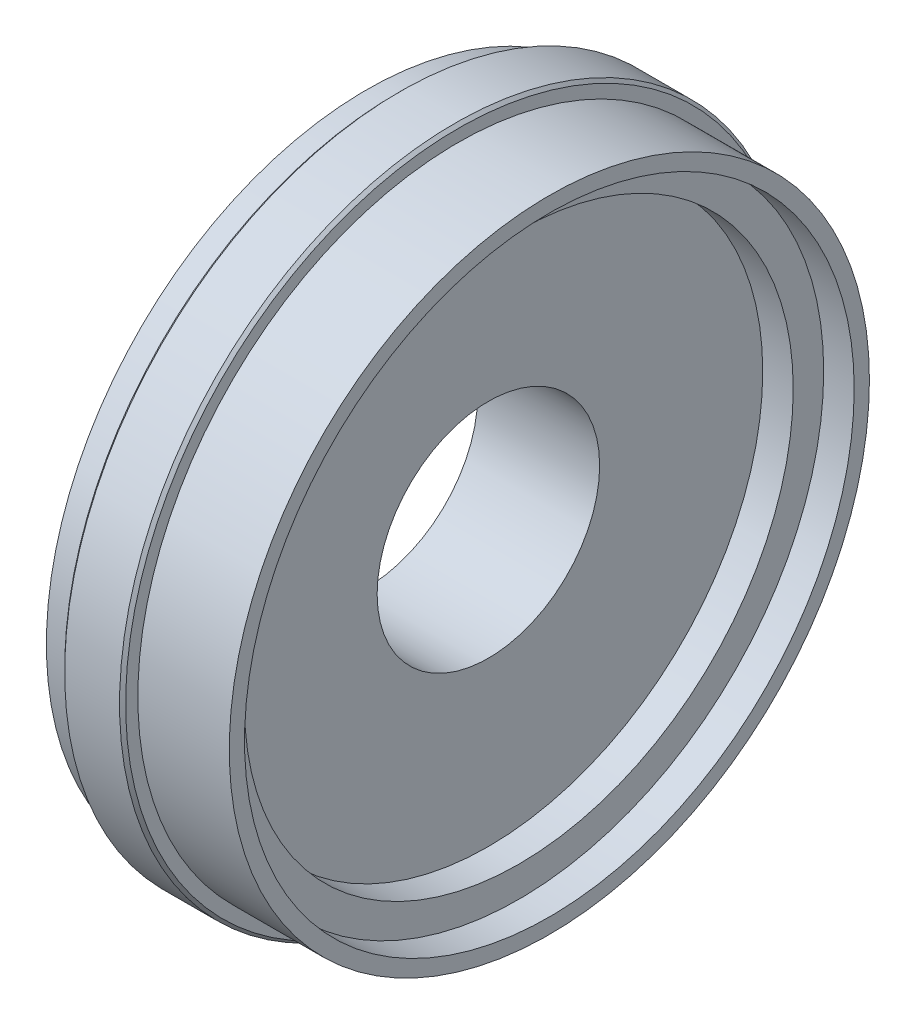
ISO-10303-21;
HEADER;
FILE_DESCRIPTION(('STEP AP214'),'2;1');
FILE_NAME('part.step','',(''),(''),'','','');
FILE_SCHEMA(('AUTOMOTIVE_DESIGN { 1 0 10303 214 1 1 1 1 }'));
ENDSEC;
DATA;
#1=APPLICATION_CONTEXT('core data for automotive mechanical design processes');
#2=APPLICATION_PROTOCOL_DEFINITION('international standard','automotive_design',2000,#1);
#3=PRODUCT_CONTEXT('',#1,'mechanical');
#4=PRODUCT('Part','Part','',(#3));
#5=PRODUCT_RELATED_PRODUCT_CATEGORY('part','',(#4));
#6=PRODUCT_DEFINITION_FORMATION('','',#4);
#7=PRODUCT_DEFINITION_CONTEXT('part definition',#1,'design');
#8=PRODUCT_DEFINITION('design','',#6,#7);
#9=PRODUCT_DEFINITION_SHAPE('','',#8);
#10=(LENGTH_UNIT() NAMED_UNIT(*) SI_UNIT(.MILLI.,.METRE.));
#11=(NAMED_UNIT(*) PLANE_ANGLE_UNIT() SI_UNIT($,.RADIAN.));
#12=(NAMED_UNIT(*) SI_UNIT($,.STERADIAN.) SOLID_ANGLE_UNIT());
#13=UNCERTAINTY_MEASURE_WITH_UNIT(LENGTH_MEASURE(1.E-05),#10,'distance_accuracy_value','');
#14=(GEOMETRIC_REPRESENTATION_CONTEXT(3) GLOBAL_UNCERTAINTY_ASSIGNED_CONTEXT((#13)) GLOBAL_UNIT_ASSIGNED_CONTEXT((#10,
#11,#12)) REPRESENTATION_CONTEXT('',''));
#15=CARTESIAN_POINT('',(0.,0.,0.));
#16=DIRECTION('',(0.,0.,1.));
#17=DIRECTION('',(1.,0.,0.));
#18=AXIS2_PLACEMENT_3D('',#15,#16,#17);
#19=CARTESIAN_POINT('',(46.38,0.,0.));
#20=DIRECTION('',(-1.,0.,0.));
#21=DIRECTION('',(0.,0.,1.));
#22=AXIS2_PLACEMENT_3D('',#19,#20,#21);
#23=CYLINDRICAL_SURFACE('',#22,9.);
#24=CARTESIAN_POINT('',(46.88,0.,0.));
#25=DIRECTION('',(-1.,0.,0.));
#26=DIRECTION('',(0.,0.,-1.));
#27=AXIS2_PLACEMENT_3D('',#24,#25,#26);
#28=CIRCLE('',#27,9.);
#29=CARTESIAN_POINT('',(46.88,0.,-9.));
#30=VERTEX_POINT('',#29);
#31=EDGE_CURVE('E118',#30,#30,#28,.T.);
#32=ORIENTED_EDGE('',*,*,#31,.F.);
#33=DIRECTION('',(-1.,0.,0.));
#34=VECTOR('',#33,1.);
#35=CARTESIAN_POINT('',(46.38,0.,-9.));
#36=LINE('',#35,#34);
#37=CARTESIAN_POINT('',(45.88,0.,-9.));
#38=VERTEX_POINT('',#37);
#39=EDGE_CURVE('E11',#30,#38,#36,.T.);
#40=ORIENTED_EDGE('',*,*,#39,.T.);
#41=CARTESIAN_POINT('',(45.88,0.,0.));
#42=DIRECTION('',(1.,0.,0.));
#43=DIRECTION('',(0.,0.,1.));
#44=AXIS2_PLACEMENT_3D('',#41,#42,#43);
#45=CIRCLE('',#44,9.);
#46=EDGE_CURVE('E28',#38,#38,#45,.T.);
#47=ORIENTED_EDGE('',*,*,#46,.F.);
#48=ORIENTED_EDGE('',*,*,#39,.F.);
#49=EDGE_LOOP('',(#32,#40,#47,#48));
#50=FACE_BOUND('',#49,.T.);
#51=ADVANCED_FACE('F17',(#50),#23,.F.);
#52=CARTESIAN_POINT('',(45.88,0.,6.325));
#53=DIRECTION('',(1.,0.,0.));
#54=DIRECTION('',(0.,1.,0.));
#55=AXIS2_PLACEMENT_3D('',#52,#53,#54);
#56=PLANE('',#55);
#57=CARTESIAN_POINT('',(45.88,0.,0.));
#58=DIRECTION('',(-1.,0.,0.));
#59=DIRECTION('',(0.,0.,-1.));
#60=AXIS2_PLACEMENT_3D('',#57,#58,#59);
#61=CIRCLE('',#60,3.65);
#62=CARTESIAN_POINT('',(45.88,0.,-3.65));
#63=VERTEX_POINT('',#62);
#64=EDGE_CURVE('E124',#63,#63,#61,.T.);
#65=ORIENTED_EDGE('',*,*,#64,.T.);
#66=EDGE_LOOP('',(#65));
#67=FACE_BOUND('',#66,.T.);
#68=ORIENTED_EDGE('',*,*,#46,.T.);
#69=EDGE_LOOP('',(#68));
#70=FACE_BOUND('',#69,.T.);
#71=ADVANCED_FACE('F19',(#67,#70),#56,.T.);
#72=CARTESIAN_POINT('',(43.88,0.,0.));
#73=DIRECTION('',(-1.,0.,0.));
#74=DIRECTION('',(0.,0.,1.));
#75=AXIS2_PLACEMENT_3D('',#72,#73,#74);
#76=CYLINDRICAL_SURFACE('',#75,3.65);
#77=ORIENTED_EDGE('',*,*,#64,.F.);
#78=DIRECTION('',(-1.,0.,0.));
#79=VECTOR('',#78,1.);
#80=CARTESIAN_POINT('',(43.88,0.,-3.65));
#81=LINE('',#80,#79);
#82=CARTESIAN_POINT('',(41.88,0.,-3.65));
#83=VERTEX_POINT('',#82);
#84=EDGE_CURVE('E120',#63,#83,#81,.T.);
#85=ORIENTED_EDGE('',*,*,#84,.T.);
#86=CARTESIAN_POINT('',(41.88,0.,0.));
#87=DIRECTION('',(1.,0.,0.));
#88=DIRECTION('',(0.,0.,1.));
#89=AXIS2_PLACEMENT_3D('',#86,#87,#88);
#90=CIRCLE('',#89,3.65);
#91=EDGE_CURVE('E131',#83,#83,#90,.T.);
#92=ORIENTED_EDGE('',*,*,#91,.F.);
#93=ORIENTED_EDGE('',*,*,#84,.F.);
#94=EDGE_LOOP('',(#77,#85,#92,#93));
#95=FACE_BOUND('',#94,.T.);
#96=ADVANCED_FACE('F224',(#95),#76,.F.);
#97=CARTESIAN_POINT('',(41.88,0.,7.075));
#98=DIRECTION('',(-1.,0.,0.));
#99=DIRECTION('',(0.,0.,1.));
#100=AXIS2_PLACEMENT_3D('',#97,#98,#99);
#101=PLANE('',#100);
#102=ORIENTED_EDGE('',*,*,#91,.T.);
#103=EDGE_LOOP('',(#102));
#104=FACE_BOUND('',#103,.T.);
#105=CARTESIAN_POINT('',(41.88,0.,0.));
#106=DIRECTION('',(-1.,0.,0.));
#107=DIRECTION('',(0.,0.,-1.));
#108=AXIS2_PLACEMENT_3D('',#105,#106,#107);
#109=CIRCLE('',#108,10.5);
#110=CARTESIAN_POINT('',(41.88,0.,-10.5));
#111=VERTEX_POINT('',#110);
#112=EDGE_CURVE('E112',#111,#111,#109,.T.);
#113=ORIENTED_EDGE('',*,*,#112,.T.);
#114=EDGE_LOOP('',(#113));
#115=FACE_BOUND('',#114,.T.);
#116=ADVANCED_FACE('F248',(#104,#115),#101,.T.);
#117=CARTESIAN_POINT('',(42.38,0.,0.));
#118=DIRECTION('',(-1.,0.,0.));
#119=DIRECTION('',(0.,0.,1.));
#120=AXIS2_PLACEMENT_3D('',#117,#118,#119);
#121=CYLINDRICAL_SURFACE('',#120,10.5);
#122=ORIENTED_EDGE('',*,*,#112,.F.);
#123=DIRECTION('',(1.,0.,0.));
#124=VECTOR('',#123,1.);
#125=CARTESIAN_POINT('',(42.38,0.,-10.5));
#126=LINE('',#125,#124);
#127=CARTESIAN_POINT('',(42.88,0.,-10.5));
#128=VERTEX_POINT('',#127);
#129=EDGE_CURVE('E90',#111,#128,#126,.T.);
#130=ORIENTED_EDGE('',*,*,#129,.T.);
#131=CARTESIAN_POINT('',(42.88,0.,0.));
#132=DIRECTION('',(1.,0.,0.));
#133=DIRECTION('',(0.,0.,1.));
#134=AXIS2_PLACEMENT_3D('',#131,#132,#133);
#135=CIRCLE('',#134,10.5);
#136=EDGE_CURVE('E104',#128,#128,#135,.T.);
#137=ORIENTED_EDGE('',*,*,#136,.F.);
#138=ORIENTED_EDGE('',*,*,#129,.F.);
#139=EDGE_LOOP('',(#122,#130,#137,#138));
#140=FACE_BOUND('',#139,.T.);
#141=ADVANCED_FACE('F215',(#140),#121,.T.);
#142=CARTESIAN_POINT('',(42.88,0.,10.75));
#143=DIRECTION('',(-1.,0.,0.));
#144=DIRECTION('',(0.,0.,1.));
#145=AXIS2_PLACEMENT_3D('',#142,#143,#144);
#146=PLANE('',#145);
#147=ORIENTED_EDGE('',*,*,#136,.T.);
#148=EDGE_LOOP('',(#147));
#149=FACE_BOUND('',#148,.T.);
#150=CARTESIAN_POINT('',(42.88,0.,0.));
#151=DIRECTION('',(-1.,0.,0.));
#152=DIRECTION('',(0.,0.,-1.));
#153=AXIS2_PLACEMENT_3D('',#150,#151,#152);
#154=CIRCLE('',#153,10.9);
#155=CARTESIAN_POINT('',(42.88,0.,-10.9));
#156=VERTEX_POINT('',#155);
#157=EDGE_CURVE('E99',#156,#156,#154,.T.);
#158=ORIENTED_EDGE('',*,*,#157,.T.);
#159=EDGE_LOOP('',(#158));
#160=FACE_BOUND('',#159,.T.);
#161=ADVANCED_FACE('F100',(#149,#160),#146,.T.);
#162=CARTESIAN_POINT('',(42.93,0.,0.));
#163=DIRECTION('',(1.,0.,0.));
#164=DIRECTION('',(0.,0.,1.));
#165=AXIS2_PLACEMENT_3D('',#162,#163,#164);
#166=CONICAL_SURFACE('',#165,10.95,0.785398163397448);
#167=CARTESIAN_POINT('',(42.98,0.,0.));
#168=DIRECTION('',(-1.,0.,0.));
#169=DIRECTION('',(0.,0.,-1.));
#170=AXIS2_PLACEMENT_3D('',#167,#168,#169);
#171=CIRCLE('',#170,11.);
#172=CARTESIAN_POINT('',(42.98,0.,-11.));
#173=VERTEX_POINT('',#172);
#174=EDGE_CURVE('E128',#173,#173,#171,.T.);
#175=ORIENTED_EDGE('',*,*,#174,.T.);
#176=DIRECTION('',(-0.707106781186548,0.,0.707106781186548));
#177=VECTOR('',#176,1.);
#178=CARTESIAN_POINT('',(42.93,0.,-10.95));
#179=LINE('',#178,#177);
#180=EDGE_CURVE('E105',#173,#156,#179,.T.);
#181=ORIENTED_EDGE('',*,*,#180,.T.);
#182=ORIENTED_EDGE('',*,*,#157,.F.);
#183=ORIENTED_EDGE('',*,*,#180,.F.);
#184=EDGE_LOOP('',(#175,#181,#182,#183));
#185=FACE_BOUND('',#184,.T.);
#186=ADVANCED_FACE('F206',(#185),#166,.T.);
#187=CARTESIAN_POINT('',(43.88,0.,0.));
#188=DIRECTION('',(-1.,0.,0.));
#189=DIRECTION('',(0.,0.,1.));
#190=AXIS2_PLACEMENT_3D('',#187,#188,#189);
#191=CYLINDRICAL_SURFACE('',#190,11.);
#192=ORIENTED_EDGE('',*,*,#174,.F.);
#193=DIRECTION('',(1.,0.,0.));
#194=VECTOR('',#193,1.);
#195=CARTESIAN_POINT('',(43.88,0.,-11.));
#196=LINE('',#195,#194);
#197=CARTESIAN_POINT('',(44.78,0.,-11.));
#198=VERTEX_POINT('',#197);
#199=EDGE_CURVE('E114',#173,#198,#196,.T.);
#200=ORIENTED_EDGE('',*,*,#199,.T.);
#201=CARTESIAN_POINT('',(44.78,0.,0.));
#202=DIRECTION('',(1.,0.,0.));
#203=DIRECTION('',(0.,0.,1.));
#204=AXIS2_PLACEMENT_3D('',#201,#202,#203);
#205=CIRCLE('',#204,11.);
#206=EDGE_CURVE('E177',#198,#198,#205,.T.);
#207=ORIENTED_EDGE('',*,*,#206,.F.);
#208=ORIENTED_EDGE('',*,*,#199,.F.);
#209=EDGE_LOOP('',(#192,#200,#207,#208));
#210=FACE_BOUND('',#209,.T.);
#211=ADVANCED_FACE('F205',(#210),#191,.T.);
#212=CARTESIAN_POINT('',(44.83,0.,0.));
#213=DIRECTION('',(-1.,0.,0.));
#214=DIRECTION('',(0.,0.,1.));
#215=AXIS2_PLACEMENT_3D('',#212,#213,#214);
#216=CONICAL_SURFACE('',#215,10.95,0.785398163397448);
#217=ORIENTED_EDGE('',*,*,#206,.T.);
#218=DIRECTION('',(0.707106781186548,0.,0.707106781186548));
#219=VECTOR('',#218,1.);
#220=CARTESIAN_POINT('',(44.83,0.,-10.95));
#221=LINE('',#220,#219);
#222=CARTESIAN_POINT('',(44.88,0.,-10.9));
#223=VERTEX_POINT('',#222);
#224=EDGE_CURVE('E178',#198,#223,#221,.T.);
#225=ORIENTED_EDGE('',*,*,#224,.T.);
#226=CARTESIAN_POINT('',(44.88,0.,0.));
#227=DIRECTION('',(1.,0.,0.));
#228=DIRECTION('',(0.,0.,1.));
#229=AXIS2_PLACEMENT_3D('',#226,#227,#228);
#230=CIRCLE('',#229,10.9);
#231=EDGE_CURVE('E134',#223,#223,#230,.T.);
#232=ORIENTED_EDGE('',*,*,#231,.F.);
#233=ORIENTED_EDGE('',*,*,#224,.F.);
#234=EDGE_LOOP('',(#217,#225,#232,#233));
#235=FACE_BOUND('',#234,.T.);
#236=ADVANCED_FACE('F200',(#235),#216,.T.);
#237=CARTESIAN_POINT('',(44.88,0.,10.75));
#238=DIRECTION('',(1.,0.,0.));
#239=DIRECTION('',(0.,1.,0.));
#240=AXIS2_PLACEMENT_3D('',#237,#238,#239);
#241=PLANE('',#240);
#242=CARTESIAN_POINT('',(44.88,0.,0.));
#243=DIRECTION('',(-1.,0.,0.));
#244=DIRECTION('',(0.,0.,-1.));
#245=AXIS2_PLACEMENT_3D('',#242,#243,#244);
#246=CIRCLE('',#245,10.5);
#247=CARTESIAN_POINT('',(44.88,0.,-10.5));
#248=VERTEX_POINT('',#247);
#249=EDGE_CURVE('E135',#248,#248,#246,.T.);
#250=ORIENTED_EDGE('',*,*,#249,.T.);
#251=EDGE_LOOP('',(#250));
#252=FACE_BOUND('',#251,.T.);
#253=ORIENTED_EDGE('',*,*,#231,.T.);
#254=EDGE_LOOP('',(#253));
#255=FACE_BOUND('',#254,.T.);
#256=ADVANCED_FACE('F199',(#252,#255),#241,.T.);
#257=CARTESIAN_POINT('',(46.38,0.,0.));
#258=DIRECTION('',(-1.,0.,0.));
#259=DIRECTION('',(0.,0.,1.));
#260=AXIS2_PLACEMENT_3D('',#257,#258,#259);
#261=CYLINDRICAL_SURFACE('',#260,10.5);
#262=ORIENTED_EDGE('',*,*,#249,.F.);
#263=DIRECTION('',(1.,0.,0.));
#264=VECTOR('',#263,1.);
#265=CARTESIAN_POINT('',(46.38,0.,-10.5));
#266=LINE('',#265,#264);
#267=CARTESIAN_POINT('',(47.88,0.,-10.5));
#268=VERTEX_POINT('',#267);
#269=EDGE_CURVE('E71',#248,#268,#266,.T.);
#270=ORIENTED_EDGE('',*,*,#269,.T.);
#271=CARTESIAN_POINT('',(47.88,0.,0.));
#272=DIRECTION('',(1.,0.,0.));
#273=DIRECTION('',(0.,0.,1.));
#274=AXIS2_PLACEMENT_3D('',#271,#272,#273);
#275=CIRCLE('',#274,10.5);
#276=EDGE_CURVE('E150',#268,#268,#275,.T.);
#277=ORIENTED_EDGE('',*,*,#276,.F.);
#278=ORIENTED_EDGE('',*,*,#269,.F.);
#279=EDGE_LOOP('',(#262,#270,#277,#278));
#280=FACE_BOUND('',#279,.T.);
#281=ADVANCED_FACE('F233',(#280),#261,.T.);
#282=CARTESIAN_POINT('',(47.88,0.,10.25));
#283=DIRECTION('',(1.,0.,0.));
#284=DIRECTION('',(0.,1.,0.));
#285=AXIS2_PLACEMENT_3D('',#282,#283,#284);
#286=PLANE('',#285);
#287=CARTESIAN_POINT('',(47.88,0.,0.));
#288=DIRECTION('',(-1.,0.,0.));
#289=DIRECTION('',(0.,0.,-1.));
#290=AXIS2_PLACEMENT_3D('',#287,#288,#289);
#291=CIRCLE('',#290,10.);
#292=CARTESIAN_POINT('',(47.88,0.,-10.));
#293=VERTEX_POINT('',#292);
#294=EDGE_CURVE('E142',#293,#293,#291,.T.);
#295=ORIENTED_EDGE('',*,*,#294,.T.);
#296=EDGE_LOOP('',(#295));
#297=FACE_BOUND('',#296,.T.);
#298=ORIENTED_EDGE('',*,*,#276,.T.);
#299=EDGE_LOOP('',(#298));
#300=FACE_BOUND('',#299,.T.);
#301=ADVANCED_FACE('F230',(#297,#300),#286,.T.);
#302=CARTESIAN_POINT('',(47.38,0.,0.));
#303=DIRECTION('',(-1.,0.,0.));
#304=DIRECTION('',(0.,0.,1.));
#305=AXIS2_PLACEMENT_3D('',#302,#303,#304);
#306=CYLINDRICAL_SURFACE('',#305,10.);
#307=ORIENTED_EDGE('',*,*,#294,.F.);
#308=DIRECTION('',(-1.,0.,0.));
#309=VECTOR('',#308,1.);
#310=CARTESIAN_POINT('',(47.38,0.,-10.));
#311=LINE('',#310,#309);
#312=CARTESIAN_POINT('',(46.88,0.,-10.));
#313=VERTEX_POINT('',#312);
#314=EDGE_CURVE('E21',#293,#313,#311,.T.);
#315=ORIENTED_EDGE('',*,*,#314,.T.);
#316=CARTESIAN_POINT('',(46.88,0.,0.));
#317=DIRECTION('',(1.,0.,0.));
#318=DIRECTION('',(0.,0.,1.));
#319=AXIS2_PLACEMENT_3D('',#316,#317,#318);
#320=CIRCLE('',#319,10.);
#321=EDGE_CURVE('E166',#313,#313,#320,.T.);
#322=ORIENTED_EDGE('',*,*,#321,.F.);
#323=ORIENTED_EDGE('',*,*,#314,.F.);
#324=EDGE_LOOP('',(#307,#315,#322,#323));
#325=FACE_BOUND('',#324,.T.);
#326=ADVANCED_FACE('F165',(#325),#306,.F.);
#327=CARTESIAN_POINT('',(46.88,0.,9.5));
#328=DIRECTION('',(1.,0.,0.));
#329=DIRECTION('',(0.,1.,0.));
#330=AXIS2_PLACEMENT_3D('',#327,#328,#329);
#331=PLANE('',#330);
#332=ORIENTED_EDGE('',*,*,#31,.T.);
#333=EDGE_LOOP('',(#332));
#334=FACE_BOUND('',#333,.T.);
#335=ORIENTED_EDGE('',*,*,#321,.T.);
#336=EDGE_LOOP('',(#335));
#337=FACE_BOUND('',#336,.T.);
#338=ADVANCED_FACE('F169',(#334,#337),#331,.T.);
#339=CLOSED_SHELL('',(#51,#71,#96,#116,#141,#161,#186,#211,#236,#256,#281,#301,#326,#338));
#340=MANIFOLD_SOLID_BREP('B1',#339);
#341=ADVANCED_BREP_SHAPE_REPRESENTATION('',(#18,#340),#14);
#342=SHAPE_DEFINITION_REPRESENTATION(#9,#341);
ENDSEC;
END-ISO-10303-21;
